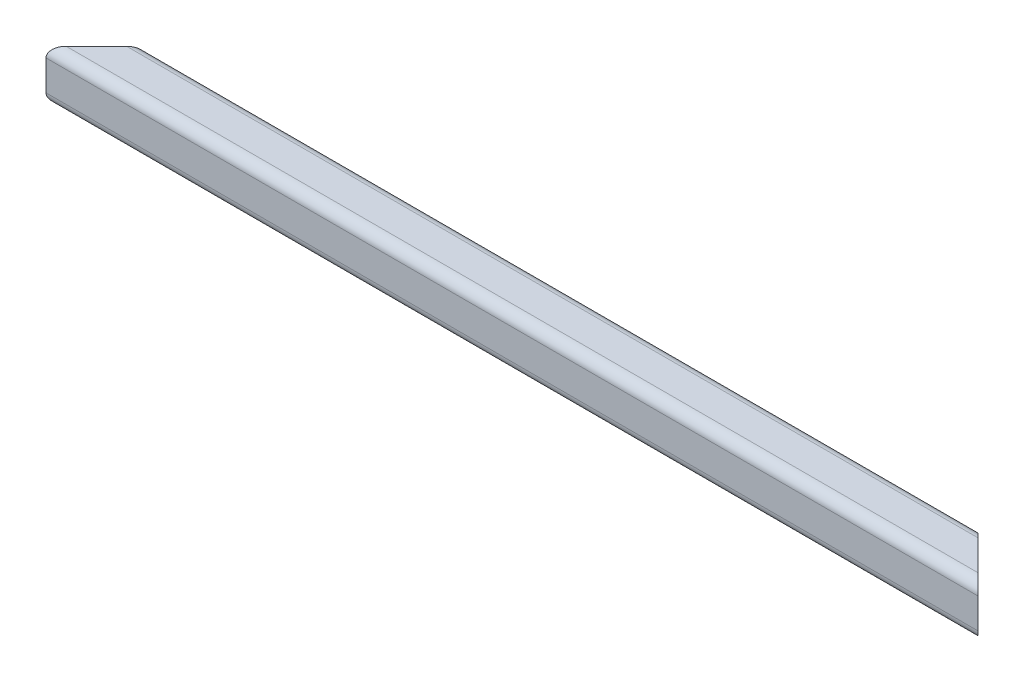
ISO-10303-21;
HEADER;
FILE_DESCRIPTION(('STEP AP214'),'2;1');
FILE_NAME('part.step','',(''),(''),'','','');
FILE_SCHEMA(('AUTOMOTIVE_DESIGN { 1 0 10303 214 1 1 1 1 }'));
ENDSEC;
DATA;
#1=APPLICATION_CONTEXT('core data for automotive mechanical design processes');
#2=APPLICATION_PROTOCOL_DEFINITION('international standard','automotive_design',2000,#1);
#3=PRODUCT_CONTEXT('',#1,'mechanical');
#4=PRODUCT('Part','Part','',(#3));
#5=PRODUCT_RELATED_PRODUCT_CATEGORY('part','',(#4));
#6=PRODUCT_DEFINITION_FORMATION('','',#4);
#7=PRODUCT_DEFINITION_CONTEXT('part definition',#1,'design');
#8=PRODUCT_DEFINITION('design','',#6,#7);
#9=PRODUCT_DEFINITION_SHAPE('','',#8);
#10=(LENGTH_UNIT() NAMED_UNIT(*) SI_UNIT(.MILLI.,.METRE.));
#11=(NAMED_UNIT(*) PLANE_ANGLE_UNIT() SI_UNIT($,.RADIAN.));
#12=(NAMED_UNIT(*) SI_UNIT($,.STERADIAN.) SOLID_ANGLE_UNIT());
#13=UNCERTAINTY_MEASURE_WITH_UNIT(LENGTH_MEASURE(1.E-05),#10,'distance_accuracy_value','');
#14=(GEOMETRIC_REPRESENTATION_CONTEXT(3) GLOBAL_UNCERTAINTY_ASSIGNED_CONTEXT((#13)) GLOBAL_UNIT_ASSIGNED_CONTEXT((#10,
#11,#12)) REPRESENTATION_CONTEXT('',''));
#15=CARTESIAN_POINT('',(0.,0.,0.));
#16=DIRECTION('',(0.,0.,1.));
#17=DIRECTION('',(1.,0.,0.));
#18=AXIS2_PLACEMENT_3D('',#15,#16,#17);
#19=CARTESIAN_POINT('',(175.,6.00000000000001,-2006.));
#20=DIRECTION('',(-1.,0.,0.));
#21=DIRECTION('',(0.,0.,1.));
#22=AXIS2_PLACEMENT_3D('',#19,#20,#21);
#23=CYLINDRICAL_SURFACE('',#22,4.);
#24=CARTESIAN_POINT('',(-169.,6.00000000000001,-2006.));
#25=DIRECTION('',(-0.707106781186547,0.,-0.707106781186548));
#26=DIRECTION('',(-0.707106781186547,0.,0.707106781186548));
#27=AXIS2_PLACEMENT_3D('',#24,#25,#26);
#28=ELLIPSE('',#27,5.65685424949239,4.);
#29=CARTESIAN_POINT('',(-169.,10.,-2006.));
#30=VERTEX_POINT('',#29);
#31=CARTESIAN_POINT('',(-165.,6.00000000000001,-2010.));
#32=VERTEX_POINT('',#31);
#33=EDGE_CURVE('E185',#30,#32,#28,.T.);
#34=ORIENTED_EDGE('',*,*,#33,.F.);
#35=DIRECTION('',(-1.,0.,0.));
#36=VECTOR('',#35,1.);
#37=CARTESIAN_POINT('',(175.,10.,-2006.));
#38=LINE('',#37,#36);
#39=CARTESIAN_POINT('',(169.,10.,-2006.));
#40=VERTEX_POINT('',#39);
#41=EDGE_CURVE('E265',#40,#30,#38,.T.);
#42=ORIENTED_EDGE('',*,*,#41,.F.);
#43=CARTESIAN_POINT('',(169.,6.00000000000001,-2006.));
#44=DIRECTION('',(0.707106781186548,0.,-0.707106781186548));
#45=DIRECTION('',(-0.707106781186547,0.,-0.707106781186548));
#46=AXIS2_PLACEMENT_3D('',#43,#44,#45);
#47=ELLIPSE('',#46,5.65685424949238,4.);
#48=CARTESIAN_POINT('',(165.,6.00000000000001,-2010.));
#49=VERTEX_POINT('',#48);
#50=EDGE_CURVE('E176',#49,#40,#47,.T.);
#51=ORIENTED_EDGE('',*,*,#50,.F.);
#52=DIRECTION('',(-1.,0.,0.));
#53=VECTOR('',#52,1.);
#54=CARTESIAN_POINT('',(175.,6.00000000000001,-2010.));
#55=LINE('',#54,#53);
#56=EDGE_CURVE('E45',#49,#32,#55,.T.);
#57=ORIENTED_EDGE('',*,*,#56,.T.);
#58=EDGE_LOOP('',(#34,#42,#51,#57));
#59=FACE_BOUND('',#58,.T.);
#60=ADVANCED_FACE('F41',(#59),#23,.T.);
#61=CARTESIAN_POINT('',(175.,10.,-2006.));
#62=DIRECTION('',(0.,-1.,0.));
#63=DIRECTION('',(0.,0.,-1.));
#64=AXIS2_PLACEMENT_3D('',#61,#62,#63);
#65=PLANE('',#64);
#66=DIRECTION('',(0.707106781186547,0.,-0.707106781186548));
#67=VECTOR('',#66,1.);
#68=CARTESIAN_POINT('',(3.00000000000003,10.,-2178.));
#69=LINE('',#68,#67);
#70=CARTESIAN_POINT('',(-181.,10.,-1994.));
#71=VERTEX_POINT('',#70);
#72=EDGE_CURVE('E182',#71,#30,#69,.T.);
#73=ORIENTED_EDGE('',*,*,#72,.F.);
#74=DIRECTION('',(-1.,0.,0.));
#75=VECTOR('',#74,1.);
#76=CARTESIAN_POINT('',(175.,10.,-1994.));
#77=LINE('',#76,#75);
#78=CARTESIAN_POINT('',(181.,10.,-1994.));
#79=VERTEX_POINT('',#78);
#80=EDGE_CURVE('E263',#79,#71,#77,.T.);
#81=ORIENTED_EDGE('',*,*,#80,.F.);
#82=DIRECTION('',(0.707106781186547,0.,0.707106781186548));
#83=VECTOR('',#82,1.);
#84=CARTESIAN_POINT('',(172.,10.,-2003.));
#85=LINE('',#84,#83);
#86=EDGE_CURVE('E281',#40,#79,#85,.T.);
#87=ORIENTED_EDGE('',*,*,#86,.F.);
#88=ORIENTED_EDGE('',*,*,#41,.T.);
#89=EDGE_LOOP('',(#73,#81,#87,#88));
#90=FACE_BOUND('',#89,.T.);
#91=ADVANCED_FACE('F272',(#90),#65,.F.);
#92=CARTESIAN_POINT('',(175.,6.00000000000001,-1994.));
#93=DIRECTION('',(-1.,0.,0.));
#94=DIRECTION('',(0.,0.,1.));
#95=AXIS2_PLACEMENT_3D('',#92,#93,#94);
#96=CYLINDRICAL_SURFACE('',#95,4.);
#97=CARTESIAN_POINT('',(-181.,6.00000000000001,-1994.));
#98=DIRECTION('',(-0.707106781186547,0.,-0.707106781186548));
#99=DIRECTION('',(-0.707106781186547,0.,0.707106781186548));
#100=AXIS2_PLACEMENT_3D('',#97,#98,#99);
#101=ELLIPSE('',#100,5.65685424949239,4.);
#102=CARTESIAN_POINT('',(-185.,6.00000000000001,-1990.));
#103=VERTEX_POINT('',#102);
#104=EDGE_CURVE('E11',#103,#71,#101,.T.);
#105=ORIENTED_EDGE('',*,*,#104,.F.);
#106=DIRECTION('',(-1.,0.,0.));
#107=VECTOR('',#106,1.);
#108=CARTESIAN_POINT('',(175.,6.00000000000001,-1990.));
#109=LINE('',#108,#107);
#110=CARTESIAN_POINT('',(185.,6.00000000000001,-1990.));
#111=VERTEX_POINT('',#110);
#112=EDGE_CURVE('E260',#111,#103,#109,.T.);
#113=ORIENTED_EDGE('',*,*,#112,.F.);
#114=CARTESIAN_POINT('',(181.,6.00000000000001,-1994.));
#115=DIRECTION('',(0.707106781186548,0.,-0.707106781186548));
#116=DIRECTION('',(-0.707106781186547,0.,-0.707106781186548));
#117=AXIS2_PLACEMENT_3D('',#114,#115,#116);
#118=ELLIPSE('',#117,5.65685424949238,4.);
#119=EDGE_CURVE('E278',#79,#111,#118,.T.);
#120=ORIENTED_EDGE('',*,*,#119,.F.);
#121=ORIENTED_EDGE('',*,*,#80,.T.);
#122=EDGE_LOOP('',(#105,#113,#120,#121));
#123=FACE_BOUND('',#122,.T.);
#124=ADVANCED_FACE('F275',(#123),#96,.T.);
#125=CARTESIAN_POINT('',(175.,-6.00000000000001,-1990.));
#126=DIRECTION('',(0.,0.,-1.));
#127=DIRECTION('',(-1.,0.,0.));
#128=AXIS2_PLACEMENT_3D('',#125,#126,#127);
#129=PLANE('',#128);
#130=DIRECTION('',(0.,1.,0.));
#131=VECTOR('',#130,1.);
#132=CARTESIAN_POINT('',(-185.,-6.00000000000001,-1990.));
#133=LINE('',#132,#131);
#134=CARTESIAN_POINT('',(-185.,-6.00000000000001,-1990.));
#135=VERTEX_POINT('',#134);
#136=EDGE_CURVE('E51',#135,#103,#133,.T.);
#137=ORIENTED_EDGE('',*,*,#136,.F.);
#138=DIRECTION('',(-1.,0.,0.));
#139=VECTOR('',#138,1.);
#140=CARTESIAN_POINT('',(175.,-6.00000000000001,-1990.));
#141=LINE('',#140,#139);
#142=CARTESIAN_POINT('',(185.,-6.00000000000001,-1990.));
#143=VERTEX_POINT('',#142);
#144=EDGE_CURVE('E257',#143,#135,#141,.T.);
#145=ORIENTED_EDGE('',*,*,#144,.F.);
#146=DIRECTION('',(0.,-1.,0.));
#147=VECTOR('',#146,1.);
#148=CARTESIAN_POINT('',(185.,-6.00000000000001,-1990.));
#149=LINE('',#148,#147);
#150=EDGE_CURVE('E280',#111,#143,#149,.T.);
#151=ORIENTED_EDGE('',*,*,#150,.F.);
#152=ORIENTED_EDGE('',*,*,#112,.T.);
#153=EDGE_LOOP('',(#137,#145,#151,#152));
#154=FACE_BOUND('',#153,.T.);
#155=ADVANCED_FACE('F291',(#154),#129,.F.);
#156=CARTESIAN_POINT('',(175.,-6.00000000000001,-1994.));
#157=DIRECTION('',(-1.,0.,0.));
#158=DIRECTION('',(0.,0.,1.));
#159=AXIS2_PLACEMENT_3D('',#156,#157,#158);
#160=CYLINDRICAL_SURFACE('',#159,4.);
#161=CARTESIAN_POINT('',(-181.,-6.00000000000001,-1994.));
#162=DIRECTION('',(-0.707106781186547,0.,-0.707106781186548));
#163=DIRECTION('',(-0.707106781186547,0.,0.707106781186548));
#164=AXIS2_PLACEMENT_3D('',#161,#162,#163);
#165=ELLIPSE('',#164,5.65685424949239,4.);
#166=CARTESIAN_POINT('',(-181.,-10.,-1994.));
#167=VERTEX_POINT('',#166);
#168=EDGE_CURVE('E200',#167,#135,#165,.T.);
#169=ORIENTED_EDGE('',*,*,#168,.F.);
#170=DIRECTION('',(-1.,0.,0.));
#171=VECTOR('',#170,1.);
#172=CARTESIAN_POINT('',(175.,-10.,-1994.));
#173=LINE('',#172,#171);
#174=CARTESIAN_POINT('',(181.,-10.,-1994.));
#175=VERTEX_POINT('',#174);
#176=EDGE_CURVE('E254',#175,#167,#173,.T.);
#177=ORIENTED_EDGE('',*,*,#176,.F.);
#178=CARTESIAN_POINT('',(181.,-6.00000000000001,-1994.));
#179=DIRECTION('',(0.707106781186548,0.,-0.707106781186548));
#180=DIRECTION('',(-0.707106781186547,0.,-0.707106781186548));
#181=AXIS2_PLACEMENT_3D('',#178,#179,#180);
#182=ELLIPSE('',#181,5.65685424949238,4.);
#183=EDGE_CURVE('E187',#143,#175,#182,.T.);
#184=ORIENTED_EDGE('',*,*,#183,.F.);
#185=ORIENTED_EDGE('',*,*,#144,.T.);
#186=EDGE_LOOP('',(#169,#177,#184,#185));
#187=FACE_BOUND('',#186,.T.);
#188=ADVANCED_FACE('F289',(#187),#160,.T.);
#189=CARTESIAN_POINT('',(175.,-10.,-1994.));
#190=DIRECTION('',(0.,1.,0.));
#191=DIRECTION('',(0.,0.,1.));
#192=AXIS2_PLACEMENT_3D('',#189,#190,#191);
#193=PLANE('',#192);
#194=DIRECTION('',(-0.707106781186547,0.,0.707106781186548));
#195=VECTOR('',#194,1.);
#196=CARTESIAN_POINT('',(-2.99999999999997,-10.,-2172.));
#197=LINE('',#196,#195);
#198=CARTESIAN_POINT('',(-169.,-10.,-2006.));
#199=VERTEX_POINT('',#198);
#200=EDGE_CURVE('E203',#199,#167,#197,.T.);
#201=ORIENTED_EDGE('',*,*,#200,.F.);
#202=DIRECTION('',(-1.,0.,0.));
#203=VECTOR('',#202,1.);
#204=CARTESIAN_POINT('',(175.,-10.,-2006.));
#205=LINE('',#204,#203);
#206=CARTESIAN_POINT('',(169.,-10.,-2006.));
#207=VERTEX_POINT('',#206);
#208=EDGE_CURVE('E252',#207,#199,#205,.T.);
#209=ORIENTED_EDGE('',*,*,#208,.F.);
#210=DIRECTION('',(-0.707106781186547,0.,-0.707106781186548));
#211=VECTOR('',#210,1.);
#212=CARTESIAN_POINT('',(178.,-10.,-1997.));
#213=LINE('',#212,#211);
#214=EDGE_CURVE('E181',#175,#207,#213,.T.);
#215=ORIENTED_EDGE('',*,*,#214,.F.);
#216=ORIENTED_EDGE('',*,*,#176,.T.);
#217=EDGE_LOOP('',(#201,#209,#215,#216));
#218=FACE_BOUND('',#217,.T.);
#219=ADVANCED_FACE('F293',(#218),#193,.F.);
#220=CARTESIAN_POINT('',(175.,-6.00000000000001,-2006.));
#221=DIRECTION('',(-1.,0.,0.));
#222=DIRECTION('',(0.,0.,1.));
#223=AXIS2_PLACEMENT_3D('',#220,#221,#222);
#224=CYLINDRICAL_SURFACE('',#223,4.);
#225=CARTESIAN_POINT('',(-169.,-6.00000000000001,-2006.));
#226=DIRECTION('',(-0.707106781186547,0.,-0.707106781186548));
#227=DIRECTION('',(-0.707106781186547,0.,0.707106781186548));
#228=AXIS2_PLACEMENT_3D('',#225,#226,#227);
#229=ELLIPSE('',#228,5.65685424949239,4.);
#230=CARTESIAN_POINT('',(-165.,-6.00000000000001,-2010.));
#231=VERTEX_POINT('',#230);
#232=EDGE_CURVE('E164',#231,#199,#229,.T.);
#233=ORIENTED_EDGE('',*,*,#232,.F.);
#234=DIRECTION('',(-1.,0.,0.));
#235=VECTOR('',#234,1.);
#236=CARTESIAN_POINT('',(175.,-6.00000000000001,-2010.));
#237=LINE('',#236,#235);
#238=CARTESIAN_POINT('',(165.,-6.00000000000001,-2010.));
#239=VERTEX_POINT('',#238);
#240=EDGE_CURVE('E156',#239,#231,#237,.T.);
#241=ORIENTED_EDGE('',*,*,#240,.F.);
#242=CARTESIAN_POINT('',(169.,-6.00000000000001,-2006.));
#243=DIRECTION('',(0.707106781186548,0.,-0.707106781186548));
#244=DIRECTION('',(-0.707106781186547,0.,-0.707106781186548));
#245=AXIS2_PLACEMENT_3D('',#242,#243,#244);
#246=ELLIPSE('',#245,5.65685424949238,4.);
#247=EDGE_CURVE('E161',#207,#239,#246,.T.);
#248=ORIENTED_EDGE('',*,*,#247,.F.);
#249=ORIENTED_EDGE('',*,*,#208,.T.);
#250=EDGE_LOOP('',(#233,#241,#248,#249));
#251=FACE_BOUND('',#250,.T.);
#252=ADVANCED_FACE('F158',(#251),#224,.T.);
#253=CARTESIAN_POINT('',(175.,6.00000000000001,-1994.));
#254=DIRECTION('',(-1.,0.,0.));
#255=DIRECTION('',(0.,0.,1.));
#256=AXIS2_PLACEMENT_3D('',#253,#254,#255);
#257=CYLINDRICAL_SURFACE('',#256,2.);
#258=DIRECTION('',(-1.,0.,0.));
#259=VECTOR('',#258,1.);
#260=CARTESIAN_POINT('',(175.,6.00000000000001,-1992.));
#261=LINE('',#260,#259);
#262=CARTESIAN_POINT('',(183.,6.00000000000001,-1992.));
#263=VERTEX_POINT('',#262);
#264=CARTESIAN_POINT('',(-183.,6.00000000000001,-1992.));
#265=VERTEX_POINT('',#264);
#266=EDGE_CURVE('E209',#263,#265,#261,.T.);
#267=ORIENTED_EDGE('',*,*,#266,.T.);
#268=CARTESIAN_POINT('',(-181.,6.00000000000001,-1994.));
#269=DIRECTION('',(-0.707106781186547,0.,-0.707106781186548));
#270=DIRECTION('',(-0.707106781186547,0.,0.707106781186548));
#271=AXIS2_PLACEMENT_3D('',#268,#269,#270);
#272=ELLIPSE('',#271,2.82842712474619,2.);
#273=CARTESIAN_POINT('',(-181.,8.00000000000001,-1994.));
#274=VERTEX_POINT('',#273);
#275=EDGE_CURVE('E87',#265,#274,#272,.T.);
#276=ORIENTED_EDGE('',*,*,#275,.T.);
#277=DIRECTION('',(-1.,0.,0.));
#278=VECTOR('',#277,1.);
#279=CARTESIAN_POINT('',(175.,8.00000000000001,-1994.));
#280=LINE('',#279,#278);
#281=CARTESIAN_POINT('',(181.,8.00000000000001,-1994.));
#282=VERTEX_POINT('',#281);
#283=EDGE_CURVE('E212',#282,#274,#280,.T.);
#284=ORIENTED_EDGE('',*,*,#283,.F.);
#285=CARTESIAN_POINT('',(181.,6.00000000000001,-1994.));
#286=DIRECTION('',(0.707106781186548,0.,-0.707106781186548));
#287=DIRECTION('',(-0.707106781186547,0.,-0.707106781186548));
#288=AXIS2_PLACEMENT_3D('',#285,#286,#287);
#289=ELLIPSE('',#288,2.82842712474619,2.);
#290=EDGE_CURVE('E208',#282,#263,#289,.T.);
#291=ORIENTED_EDGE('',*,*,#290,.T.);
#292=EDGE_LOOP('',(#267,#276,#284,#291));
#293=FACE_BOUND('',#292,.T.);
#294=ADVANCED_FACE('F300',(#293),#257,.F.);
#295=CARTESIAN_POINT('',(175.,8.00000000000001,-2006.));
#296=DIRECTION('',(0.,-1.,0.));
#297=DIRECTION('',(0.,0.,-1.));
#298=AXIS2_PLACEMENT_3D('',#295,#296,#297);
#299=PLANE('',#298);
#300=ORIENTED_EDGE('',*,*,#283,.T.);
#301=DIRECTION('',(0.707106781186547,0.,-0.707106781186548));
#302=VECTOR('',#301,1.);
#303=CARTESIAN_POINT('',(3.00000000000003,8.00000000000001,-2178.));
#304=LINE('',#303,#302);
#305=CARTESIAN_POINT('',(-169.,8.00000000000001,-2006.));
#306=VERTEX_POINT('',#305);
#307=EDGE_CURVE('E60',#274,#306,#304,.T.);
#308=ORIENTED_EDGE('',*,*,#307,.T.);
#309=DIRECTION('',(-1.,0.,0.));
#310=VECTOR('',#309,1.);
#311=CARTESIAN_POINT('',(175.,8.00000000000001,-2006.));
#312=LINE('',#311,#310);
#313=CARTESIAN_POINT('',(169.,8.00000000000001,-2006.));
#314=VERTEX_POINT('',#313);
#315=EDGE_CURVE('E217',#314,#306,#312,.T.);
#316=ORIENTED_EDGE('',*,*,#315,.F.);
#317=DIRECTION('',(0.707106781186547,0.,0.707106781186548));
#318=VECTOR('',#317,1.);
#319=CARTESIAN_POINT('',(172.,8.00000000000001,-2003.));
#320=LINE('',#319,#318);
#321=EDGE_CURVE('E211',#314,#282,#320,.T.);
#322=ORIENTED_EDGE('',*,*,#321,.T.);
#323=EDGE_LOOP('',(#300,#308,#316,#322));
#324=FACE_BOUND('',#323,.T.);
#325=ADVANCED_FACE('F342',(#324),#299,.T.);
#326=CARTESIAN_POINT('',(175.,6.00000000000001,-2006.));
#327=DIRECTION('',(-1.,0.,0.));
#328=DIRECTION('',(0.,0.,1.));
#329=AXIS2_PLACEMENT_3D('',#326,#327,#328);
#330=CYLINDRICAL_SURFACE('',#329,2.);
#331=ORIENTED_EDGE('',*,*,#315,.T.);
#332=CARTESIAN_POINT('',(-169.,6.00000000000001,-2006.));
#333=DIRECTION('',(-0.707106781186547,0.,-0.707106781186548));
#334=DIRECTION('',(-0.707106781186547,0.,0.707106781186548));
#335=AXIS2_PLACEMENT_3D('',#332,#333,#334);
#336=ELLIPSE('',#335,2.82842712474619,2.);
#337=CARTESIAN_POINT('',(-167.,6.00000000000001,-2008.));
#338=VERTEX_POINT('',#337);
#339=EDGE_CURVE('E213',#306,#338,#336,.T.);
#340=ORIENTED_EDGE('',*,*,#339,.T.);
#341=DIRECTION('',(-1.,0.,0.));
#342=VECTOR('',#341,1.);
#343=CARTESIAN_POINT('',(175.,6.00000000000001,-2008.));
#344=LINE('',#343,#342);
#345=CARTESIAN_POINT('',(167.,6.00000000000001,-2008.));
#346=VERTEX_POINT('',#345);
#347=EDGE_CURVE('E222',#346,#338,#344,.T.);
#348=ORIENTED_EDGE('',*,*,#347,.F.);
#349=CARTESIAN_POINT('',(169.,6.00000000000001,-2006.));
#350=DIRECTION('',(0.707106781186548,0.,-0.707106781186548));
#351=DIRECTION('',(-0.707106781186547,0.,-0.707106781186548));
#352=AXIS2_PLACEMENT_3D('',#349,#350,#351);
#353=ELLIPSE('',#352,2.82842712474619,2.);
#354=EDGE_CURVE('E216',#346,#314,#353,.T.);
#355=ORIENTED_EDGE('',*,*,#354,.T.);
#356=EDGE_LOOP('',(#331,#340,#348,#355));
#357=FACE_BOUND('',#356,.T.);
#358=ADVANCED_FACE('F352',(#357),#330,.F.);
#359=CARTESIAN_POINT('',(175.,6.00000000000001,-2008.));
#360=DIRECTION('',(0.,0.,1.));
#361=DIRECTION('',(1.,0.,0.));
#362=AXIS2_PLACEMENT_3D('',#359,#360,#361);
#363=PLANE('',#362);
#364=ORIENTED_EDGE('',*,*,#347,.T.);
#365=DIRECTION('',(0.,-1.,0.));
#366=VECTOR('',#365,1.);
#367=CARTESIAN_POINT('',(-167.,6.00000000000001,-2008.));
#368=LINE('',#367,#366);
#369=CARTESIAN_POINT('',(-167.,-6.00000000000001,-2008.));
#370=VERTEX_POINT('',#369);
#371=EDGE_CURVE('E218',#338,#370,#368,.T.);
#372=ORIENTED_EDGE('',*,*,#371,.T.);
#373=DIRECTION('',(-1.,0.,0.));
#374=VECTOR('',#373,1.);
#375=CARTESIAN_POINT('',(175.,-6.00000000000001,-2008.));
#376=LINE('',#375,#374);
#377=CARTESIAN_POINT('',(167.,-6.00000000000001,-2008.));
#378=VERTEX_POINT('',#377);
#379=EDGE_CURVE('E227',#378,#370,#376,.T.);
#380=ORIENTED_EDGE('',*,*,#379,.F.);
#381=DIRECTION('',(0.,1.,0.));
#382=VECTOR('',#381,1.);
#383=CARTESIAN_POINT('',(167.,6.00000000000001,-2008.));
#384=LINE('',#383,#382);
#385=EDGE_CURVE('E221',#378,#346,#384,.T.);
#386=ORIENTED_EDGE('',*,*,#385,.T.);
#387=EDGE_LOOP('',(#364,#372,#380,#386));
#388=FACE_BOUND('',#387,.T.);
#389=ADVANCED_FACE('F362',(#388),#363,.T.);
#390=CARTESIAN_POINT('',(175.,-6.00000000000001,-2006.));
#391=DIRECTION('',(-1.,0.,0.));
#392=DIRECTION('',(0.,0.,1.));
#393=AXIS2_PLACEMENT_3D('',#390,#391,#392);
#394=CYLINDRICAL_SURFACE('',#393,2.);
#395=ORIENTED_EDGE('',*,*,#379,.T.);
#396=CARTESIAN_POINT('',(-169.,-6.00000000000001,-2006.));
#397=DIRECTION('',(-0.707106781186547,0.,-0.707106781186548));
#398=DIRECTION('',(-0.707106781186547,0.,0.707106781186548));
#399=AXIS2_PLACEMENT_3D('',#396,#397,#398);
#400=ELLIPSE('',#399,2.82842712474619,2.);
#401=CARTESIAN_POINT('',(-169.,-8.00000000000001,-2006.));
#402=VERTEX_POINT('',#401);
#403=EDGE_CURVE('E223',#370,#402,#400,.T.);
#404=ORIENTED_EDGE('',*,*,#403,.T.);
#405=DIRECTION('',(-1.,0.,0.));
#406=VECTOR('',#405,1.);
#407=CARTESIAN_POINT('',(175.,-8.00000000000001,-2006.));
#408=LINE('',#407,#406);
#409=CARTESIAN_POINT('',(169.,-8.00000000000001,-2006.));
#410=VERTEX_POINT('',#409);
#411=EDGE_CURVE('E232',#410,#402,#408,.T.);
#412=ORIENTED_EDGE('',*,*,#411,.F.);
#413=CARTESIAN_POINT('',(169.,-6.00000000000001,-2006.));
#414=DIRECTION('',(0.707106781186548,0.,-0.707106781186548));
#415=DIRECTION('',(-0.707106781186547,0.,-0.707106781186548));
#416=AXIS2_PLACEMENT_3D('',#413,#414,#415);
#417=ELLIPSE('',#416,2.82842712474619,2.);
#418=EDGE_CURVE('E226',#410,#378,#417,.T.);
#419=ORIENTED_EDGE('',*,*,#418,.T.);
#420=EDGE_LOOP('',(#395,#404,#412,#419));
#421=FACE_BOUND('',#420,.T.);
#422=ADVANCED_FACE('F372',(#421),#394,.F.);
#423=CARTESIAN_POINT('',(175.,-8.00000000000001,-1994.));
#424=DIRECTION('',(0.,1.,0.));
#425=DIRECTION('',(0.,0.,1.));
#426=AXIS2_PLACEMENT_3D('',#423,#424,#425);
#427=PLANE('',#426);
#428=ORIENTED_EDGE('',*,*,#411,.T.);
#429=DIRECTION('',(-0.707106781186547,0.,0.707106781186548));
#430=VECTOR('',#429,1.);
#431=CARTESIAN_POINT('',(-2.99999999999997,-8.00000000000001,-2172.));
#432=LINE('',#431,#430);
#433=CARTESIAN_POINT('',(-181.,-8.00000000000001,-1994.));
#434=VERTEX_POINT('',#433);
#435=EDGE_CURVE('E228',#402,#434,#432,.T.);
#436=ORIENTED_EDGE('',*,*,#435,.T.);
#437=DIRECTION('',(-1.,0.,0.));
#438=VECTOR('',#437,1.);
#439=CARTESIAN_POINT('',(175.,-8.00000000000001,-1994.));
#440=LINE('',#439,#438);
#441=CARTESIAN_POINT('',(181.,-8.00000000000001,-1994.));
#442=VERTEX_POINT('',#441);
#443=EDGE_CURVE('E236',#442,#434,#440,.T.);
#444=ORIENTED_EDGE('',*,*,#443,.F.);
#445=DIRECTION('',(-0.707106781186547,0.,-0.707106781186548));
#446=VECTOR('',#445,1.);
#447=CARTESIAN_POINT('',(178.,-8.00000000000001,-1997.));
#448=LINE('',#447,#446);
#449=EDGE_CURVE('E231',#442,#410,#448,.T.);
#450=ORIENTED_EDGE('',*,*,#449,.T.);
#451=EDGE_LOOP('',(#428,#436,#444,#450));
#452=FACE_BOUND('',#451,.T.);
#453=ADVANCED_FACE('F382',(#452),#427,.T.);
#454=CARTESIAN_POINT('',(175.,-6.00000000000001,-1994.));
#455=DIRECTION('',(-1.,0.,0.));
#456=DIRECTION('',(0.,0.,1.));
#457=AXIS2_PLACEMENT_3D('',#454,#455,#456);
#458=CYLINDRICAL_SURFACE('',#457,2.);
#459=ORIENTED_EDGE('',*,*,#443,.T.);
#460=CARTESIAN_POINT('',(-181.,-6.00000000000001,-1994.));
#461=DIRECTION('',(-0.707106781186547,0.,-0.707106781186548));
#462=DIRECTION('',(-0.707106781186547,0.,0.707106781186548));
#463=AXIS2_PLACEMENT_3D('',#460,#461,#462);
#464=ELLIPSE('',#463,2.82842712474619,2.);
#465=CARTESIAN_POINT('',(-183.,-6.00000000000001,-1992.));
#466=VERTEX_POINT('',#465);
#467=EDGE_CURVE('E233',#434,#466,#464,.T.);
#468=ORIENTED_EDGE('',*,*,#467,.T.);
#469=DIRECTION('',(-1.,0.,0.));
#470=VECTOR('',#469,1.);
#471=CARTESIAN_POINT('',(175.,-6.00000000000001,-1992.));
#472=LINE('',#471,#470);
#473=CARTESIAN_POINT('',(183.,-6.00000000000001,-1992.));
#474=VERTEX_POINT('',#473);
#475=EDGE_CURVE('E194',#474,#466,#472,.T.);
#476=ORIENTED_EDGE('',*,*,#475,.F.);
#477=CARTESIAN_POINT('',(181.,-6.00000000000001,-1994.));
#478=DIRECTION('',(0.707106781186548,0.,-0.707106781186548));
#479=DIRECTION('',(-0.707106781186547,0.,-0.707106781186548));
#480=AXIS2_PLACEMENT_3D('',#477,#478,#479);
#481=ELLIPSE('',#480,2.82842712474619,2.);
#482=EDGE_CURVE('E235',#474,#442,#481,.T.);
#483=ORIENTED_EDGE('',*,*,#482,.T.);
#484=EDGE_LOOP('',(#459,#468,#476,#483));
#485=FACE_BOUND('',#484,.T.);
#486=ADVANCED_FACE('F392',(#485),#458,.F.);
#487=CARTESIAN_POINT('',(175.,-6.00000000000001,-1992.));
#488=DIRECTION('',(0.,0.,-1.));
#489=DIRECTION('',(-1.,0.,0.));
#490=AXIS2_PLACEMENT_3D('',#487,#488,#489);
#491=PLANE('',#490);
#492=ORIENTED_EDGE('',*,*,#475,.T.);
#493=DIRECTION('',(0.,1.,0.));
#494=VECTOR('',#493,1.);
#495=CARTESIAN_POINT('',(-183.,-6.00000000000001,-1992.));
#496=LINE('',#495,#494);
#497=EDGE_CURVE('E82',#466,#265,#496,.T.);
#498=ORIENTED_EDGE('',*,*,#497,.T.);
#499=ORIENTED_EDGE('',*,*,#266,.F.);
#500=DIRECTION('',(0.,-1.,0.));
#501=VECTOR('',#500,1.);
#502=CARTESIAN_POINT('',(183.,-6.00000000000001,-1992.));
#503=LINE('',#502,#501);
#504=EDGE_CURVE('E169',#263,#474,#503,.T.);
#505=ORIENTED_EDGE('',*,*,#504,.T.);
#506=EDGE_LOOP('',(#492,#498,#499,#505));
#507=FACE_BOUND('',#506,.T.);
#508=ADVANCED_FACE('F402',(#507),#491,.T.);
#509=CARTESIAN_POINT('',(175.,6.00000000000001,-2010.));
#510=DIRECTION('',(0.,0.,1.));
#511=DIRECTION('',(1.,0.,0.));
#512=AXIS2_PLACEMENT_3D('',#509,#510,#511);
#513=PLANE('',#512);
#514=DIRECTION('',(0.,-1.,0.));
#515=VECTOR('',#514,1.);
#516=CARTESIAN_POINT('',(-165.,6.00000000000001,-2010.));
#517=LINE('',#516,#515);
#518=EDGE_CURVE('E196',#32,#231,#517,.T.);
#519=ORIENTED_EDGE('',*,*,#518,.F.);
#520=ORIENTED_EDGE('',*,*,#56,.F.);
#521=DIRECTION('',(0.,1.,0.));
#522=VECTOR('',#521,1.);
#523=CARTESIAN_POINT('',(165.,6.00000000000001,-2010.));
#524=LINE('',#523,#522);
#525=EDGE_CURVE('E168',#239,#49,#524,.T.);
#526=ORIENTED_EDGE('',*,*,#525,.F.);
#527=ORIENTED_EDGE('',*,*,#240,.T.);
#528=EDGE_LOOP('',(#519,#520,#526,#527));
#529=FACE_BOUND('',#528,.T.);
#530=ADVANCED_FACE('F172',(#529),#513,.F.);
#531=CARTESIAN_POINT('',(175.,0.,-2000.));
#532=DIRECTION('',(0.707106781186548,0.,-0.707106781186548));
#533=DIRECTION('',(-0.707106781186547,0.,-0.707106781186548));
#534=AXIS2_PLACEMENT_3D('',#531,#532,#533);
#535=PLANE('',#534);
#536=ORIENTED_EDGE('',*,*,#290,.F.);
#537=ORIENTED_EDGE('',*,*,#321,.F.);
#538=ORIENTED_EDGE('',*,*,#354,.F.);
#539=ORIENTED_EDGE('',*,*,#385,.F.);
#540=ORIENTED_EDGE('',*,*,#418,.F.);
#541=ORIENTED_EDGE('',*,*,#449,.F.);
#542=ORIENTED_EDGE('',*,*,#482,.F.);
#543=ORIENTED_EDGE('',*,*,#504,.F.);
#544=EDGE_LOOP('',(#536,#537,#538,#539,#540,#541,#542,#543));
#545=FACE_BOUND('',#544,.T.);
#546=ORIENTED_EDGE('',*,*,#525,.T.);
#547=ORIENTED_EDGE('',*,*,#50,.T.);
#548=ORIENTED_EDGE('',*,*,#86,.T.);
#549=ORIENTED_EDGE('',*,*,#119,.T.);
#550=ORIENTED_EDGE('',*,*,#150,.T.);
#551=ORIENTED_EDGE('',*,*,#183,.T.);
#552=ORIENTED_EDGE('',*,*,#214,.T.);
#553=ORIENTED_EDGE('',*,*,#247,.T.);
#554=EDGE_LOOP('',(#546,#547,#548,#549,#550,#551,#552,#553));
#555=FACE_BOUND('',#554,.T.);
#556=ADVANCED_FACE('F179',(#545,#555),#535,.T.);
#557=CARTESIAN_POINT('',(-175.,0.,-2000.));
#558=DIRECTION('',(-0.707106781186547,0.,-0.707106781186548));
#559=DIRECTION('',(-0.707106781186547,0.,0.707106781186548));
#560=AXIS2_PLACEMENT_3D('',#557,#558,#559);
#561=PLANE('',#560);
#562=ORIENTED_EDGE('',*,*,#275,.F.);
#563=ORIENTED_EDGE('',*,*,#497,.F.);
#564=ORIENTED_EDGE('',*,*,#467,.F.);
#565=ORIENTED_EDGE('',*,*,#435,.F.);
#566=ORIENTED_EDGE('',*,*,#403,.F.);
#567=ORIENTED_EDGE('',*,*,#371,.F.);
#568=ORIENTED_EDGE('',*,*,#339,.F.);
#569=ORIENTED_EDGE('',*,*,#307,.F.);
#570=EDGE_LOOP('',(#562,#563,#564,#565,#566,#567,#568,#569));
#571=FACE_BOUND('',#570,.T.);
#572=ORIENTED_EDGE('',*,*,#72,.T.);
#573=ORIENTED_EDGE('',*,*,#33,.T.);
#574=ORIENTED_EDGE('',*,*,#518,.T.);
#575=ORIENTED_EDGE('',*,*,#232,.T.);
#576=ORIENTED_EDGE('',*,*,#200,.T.);
#577=ORIENTED_EDGE('',*,*,#168,.T.);
#578=ORIENTED_EDGE('',*,*,#136,.T.);
#579=ORIENTED_EDGE('',*,*,#104,.T.);
#580=EDGE_LOOP('',(#572,#573,#574,#575,#576,#577,#578,#579));
#581=FACE_BOUND('',#580,.T.);
#582=ADVANCED_FACE('F43',(#571,#581),#561,.T.);
#583=CLOSED_SHELL('',(#60,#91,#124,#155,#188,#219,#252,#294,#325,#358,#389,#422,#453,#486,#508,
#530,#556,#582));
#584=MANIFOLD_SOLID_BREP('B2',#583);
#585=ADVANCED_BREP_SHAPE_REPRESENTATION('',(#18,#584),#14);
#586=SHAPE_DEFINITION_REPRESENTATION(#9,#585);
ENDSEC;
END-ISO-10303-21;
